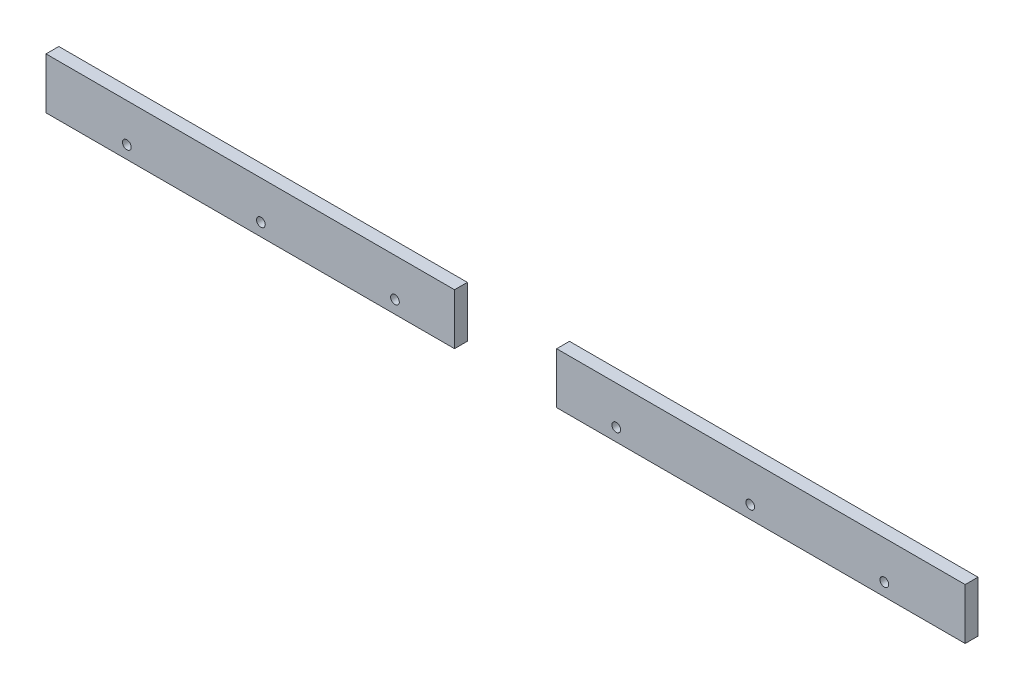
ISO-10303-21;
HEADER;
FILE_DESCRIPTION(('STEP AP214'),'2;1');
FILE_NAME('part.step','',(''),(''),'','','');
FILE_SCHEMA(('AUTOMOTIVE_DESIGN { 1 0 10303 214 1 1 1 1 }'));
ENDSEC;
DATA;
#1=APPLICATION_CONTEXT('core data for automotive mechanical design processes');
#2=APPLICATION_PROTOCOL_DEFINITION('international standard','automotive_design',2000,#1);
#3=PRODUCT_CONTEXT('',#1,'mechanical');
#4=PRODUCT('Part','Part','',(#3));
#5=PRODUCT_RELATED_PRODUCT_CATEGORY('part','',(#4));
#6=PRODUCT_DEFINITION_FORMATION('','',#4);
#7=PRODUCT_DEFINITION_CONTEXT('part definition',#1,'design');
#8=PRODUCT_DEFINITION('design','',#6,#7);
#9=PRODUCT_DEFINITION_SHAPE('','',#8);
#10=(LENGTH_UNIT() NAMED_UNIT(*) SI_UNIT(.MILLI.,.METRE.));
#11=(NAMED_UNIT(*) PLANE_ANGLE_UNIT() SI_UNIT($,.RADIAN.));
#12=(NAMED_UNIT(*) SI_UNIT($,.STERADIAN.) SOLID_ANGLE_UNIT());
#13=UNCERTAINTY_MEASURE_WITH_UNIT(LENGTH_MEASURE(1.E-05),#10,'distance_accuracy_value','');
#14=(GEOMETRIC_REPRESENTATION_CONTEXT(3) GLOBAL_UNCERTAINTY_ASSIGNED_CONTEXT((#13)) GLOBAL_UNIT_ASSIGNED_CONTEXT((#10,
#11,#12)) REPRESENTATION_CONTEXT('',''));
#15=CARTESIAN_POINT('',(0.,0.,0.));
#16=DIRECTION('',(0.,0.,1.));
#17=DIRECTION('',(1.,0.,0.));
#18=AXIS2_PLACEMENT_3D('',#15,#16,#17);
#19=CARTESIAN_POINT('',(-342.9,19.05,9.5631));
#20=DIRECTION('',(0.,-1.,0.));
#21=DIRECTION('',(0.,0.,-1.));
#22=AXIS2_PLACEMENT_3D('',#19,#20,#21);
#23=PLANE('',#22);
#24=DIRECTION('',(-1.,0.,0.));
#25=VECTOR('',#24,1.);
#26=CARTESIAN_POINT('',(-342.9,19.05,9.5631));
#27=LINE('',#26,#25);
#28=CARTESIAN_POINT('',(-38.0999999999997,19.0500000000001,9.5631));
#29=VERTEX_POINT('',#28);
#30=CARTESIAN_POINT('',(-342.9,19.05,9.5631));
#31=VERTEX_POINT('',#30);
#32=EDGE_CURVE('E90',#29,#31,#27,.T.);
#33=ORIENTED_EDGE('',*,*,#32,.F.);
#34=DIRECTION('',(0.,0.,1.));
#35=VECTOR('',#34,1.);
#36=CARTESIAN_POINT('',(-38.0999999999997,19.0500000000001,0.));
#37=LINE('',#36,#35);
#38=CARTESIAN_POINT('',(-38.0999999999997,19.0500000000001,0.));
#39=VERTEX_POINT('',#38);
#40=EDGE_CURVE('E12',#39,#29,#37,.T.);
#41=ORIENTED_EDGE('',*,*,#40,.F.);
#42=DIRECTION('',(-1.,0.,0.));
#43=VECTOR('',#42,1.);
#44=CARTESIAN_POINT('',(-342.9,19.05,0.));
#45=LINE('',#44,#43);
#46=CARTESIAN_POINT('',(-342.9,19.05,0.));
#47=VERTEX_POINT('',#46);
#48=EDGE_CURVE('E48',#39,#47,#45,.T.);
#49=ORIENTED_EDGE('',*,*,#48,.T.);
#50=DIRECTION('',(0.,0.,-1.));
#51=VECTOR('',#50,1.);
#52=CARTESIAN_POINT('',(-342.9,19.05,9.5631));
#53=LINE('',#52,#51);
#54=EDGE_CURVE('E97',#31,#47,#53,.T.);
#55=ORIENTED_EDGE('',*,*,#54,.F.);
#56=EDGE_LOOP('',(#33,#41,#49,#55));
#57=FACE_BOUND('',#56,.T.);
#58=ADVANCED_FACE('F45',(#57),#23,.F.);
#59=CARTESIAN_POINT('',(-342.9,-19.05,9.5631));
#60=DIRECTION('',(0.,1.,0.));
#61=DIRECTION('',(0.,0.,1.));
#62=AXIS2_PLACEMENT_3D('',#59,#60,#61);
#63=PLANE('',#62);
#64=DIRECTION('',(1.,0.,0.));
#65=VECTOR('',#64,1.);
#66=CARTESIAN_POINT('',(-342.9,-19.05,0.));
#67=LINE('',#66,#65);
#68=CARTESIAN_POINT('',(-342.9,-19.05,0.));
#69=VERTEX_POINT('',#68);
#70=CARTESIAN_POINT('',(-38.0999999999997,-19.05,0.));
#71=VERTEX_POINT('',#70);
#72=EDGE_CURVE('E128',#69,#71,#67,.T.);
#73=ORIENTED_EDGE('',*,*,#72,.T.);
#74=DIRECTION('',(0.,0.,1.));
#75=VECTOR('',#74,1.);
#76=CARTESIAN_POINT('',(-38.0999999999997,-19.05,0.));
#77=LINE('',#76,#75);
#78=CARTESIAN_POINT('',(-38.0999999999997,-19.05,9.5631));
#79=VERTEX_POINT('',#78);
#80=EDGE_CURVE('E127',#71,#79,#77,.T.);
#81=ORIENTED_EDGE('',*,*,#80,.T.);
#82=DIRECTION('',(1.,0.,0.));
#83=VECTOR('',#82,1.);
#84=CARTESIAN_POINT('',(-342.9,-19.05,9.5631));
#85=LINE('',#84,#83);
#86=CARTESIAN_POINT('',(-342.9,-19.05,9.5631));
#87=VERTEX_POINT('',#86);
#88=EDGE_CURVE('E95',#87,#79,#85,.T.);
#89=ORIENTED_EDGE('',*,*,#88,.F.);
#90=DIRECTION('',(0.,0.,-1.));
#91=VECTOR('',#90,1.);
#92=CARTESIAN_POINT('',(-342.9,-19.05,9.5631));
#93=LINE('',#92,#91);
#94=EDGE_CURVE('E101',#87,#69,#93,.T.);
#95=ORIENTED_EDGE('',*,*,#94,.T.);
#96=EDGE_LOOP('',(#73,#81,#89,#95));
#97=FACE_BOUND('',#96,.T.);
#98=ADVANCED_FACE('F134',(#97),#63,.F.);
#99=CARTESIAN_POINT('',(0.,0.,9.5631));
#100=DIRECTION('',(0.,0.,-1.));
#101=DIRECTION('',(-1.,0.,0.));
#102=AXIS2_PLACEMENT_3D('',#99,#100,#101);
#103=PLANE('',#102);
#104=CARTESIAN_POINT('',(-82.5499999999997,-9.52500000000001,9.5631));
#105=DIRECTION('',(0.,0.,1.));
#106=DIRECTION('',(1.,0.,0.));
#107=AXIS2_PLACEMENT_3D('',#104,#105,#106);
#108=CIRCLE('',#107,3.25000000000001);
#109=CARTESIAN_POINT('',(-79.2999999999997,-9.52500000000001,9.5631));
#110=VERTEX_POINT('',#109);
#111=EDGE_CURVE('E98',#110,#110,#108,.T.);
#112=ORIENTED_EDGE('',*,*,#111,.F.);
#113=EDGE_LOOP('',(#112));
#114=FACE_BOUND('',#113,.T.);
#115=CARTESIAN_POINT('',(-182.5625,-9.52500000000001,9.5631));
#116=DIRECTION('',(0.,0.,1.));
#117=DIRECTION('',(1.,0.,0.));
#118=AXIS2_PLACEMENT_3D('',#115,#116,#117);
#119=CIRCLE('',#118,3.25000000000001);
#120=CARTESIAN_POINT('',(-179.3125,-9.52500000000001,9.5631));
#121=VERTEX_POINT('',#120);
#122=EDGE_CURVE('E113',#121,#121,#119,.T.);
#123=ORIENTED_EDGE('',*,*,#122,.F.);
#124=EDGE_LOOP('',(#123));
#125=FACE_BOUND('',#124,.T.);
#126=CARTESIAN_POINT('',(-282.575,-9.52500000000001,9.5631));
#127=DIRECTION('',(0.,0.,1.));
#128=DIRECTION('',(1.,0.,0.));
#129=AXIS2_PLACEMENT_3D('',#126,#127,#128);
#130=CIRCLE('',#129,3.24999999999995);
#131=CARTESIAN_POINT('',(-279.325,-9.52500000000001,9.5631));
#132=VERTEX_POINT('',#131);
#133=EDGE_CURVE('E119',#132,#132,#130,.T.);
#134=ORIENTED_EDGE('',*,*,#133,.F.);
#135=EDGE_LOOP('',(#134));
#136=FACE_BOUND('',#135,.T.);
#137=ORIENTED_EDGE('',*,*,#88,.T.);
#138=DIRECTION('',(0.,-1.,0.));
#139=VECTOR('',#138,1.);
#140=CARTESIAN_POINT('',(-38.0999999999997,19.0500000000001,9.5631));
#141=LINE('',#140,#139);
#142=EDGE_CURVE('E54',#29,#79,#141,.T.);
#143=ORIENTED_EDGE('',*,*,#142,.F.);
#144=ORIENTED_EDGE('',*,*,#32,.T.);
#145=DIRECTION('',(0.,-1.,0.));
#146=VECTOR('',#145,1.);
#147=CARTESIAN_POINT('',(-342.9,-19.05,9.5631));
#148=LINE('',#147,#146);
#149=EDGE_CURVE('E94',#31,#87,#148,.T.);
#150=ORIENTED_EDGE('',*,*,#149,.T.);
#151=EDGE_LOOP('',(#137,#143,#144,#150));
#152=FACE_BOUND('',#151,.T.);
#153=ADVANCED_FACE('F92',(#114,#125,#136,#152),#103,.F.);
#154=CARTESIAN_POINT('',(0.,0.,0.));
#155=DIRECTION('',(0.,0.,-1.));
#156=DIRECTION('',(-1.,0.,0.));
#157=AXIS2_PLACEMENT_3D('',#154,#155,#156);
#158=PLANE('',#157);
#159=DIRECTION('',(0.,-1.,0.));
#160=VECTOR('',#159,1.);
#161=CARTESIAN_POINT('',(-38.0999999999997,19.0500000000001,0.));
#162=LINE('',#161,#160);
#163=EDGE_CURVE('E103',#39,#71,#162,.T.);
#164=ORIENTED_EDGE('',*,*,#163,.T.);
#165=ORIENTED_EDGE('',*,*,#72,.F.);
#166=DIRECTION('',(0.,-1.,0.));
#167=VECTOR('',#166,1.);
#168=CARTESIAN_POINT('',(-342.9,-19.05,0.));
#169=LINE('',#168,#167);
#170=EDGE_CURVE('E78',#47,#69,#169,.T.);
#171=ORIENTED_EDGE('',*,*,#170,.F.);
#172=ORIENTED_EDGE('',*,*,#48,.F.);
#173=EDGE_LOOP('',(#164,#165,#171,#172));
#174=FACE_BOUND('',#173,.T.);
#175=CARTESIAN_POINT('',(-82.5499999999997,-9.52500000000001,0.));
#176=DIRECTION('',(0.,0.,1.));
#177=DIRECTION('',(1.,0.,0.));
#178=AXIS2_PLACEMENT_3D('',#175,#176,#177);
#179=CIRCLE('',#178,3.25000000000001);
#180=CARTESIAN_POINT('',(-79.2999999999997,-9.52500000000001,0.));
#181=VERTEX_POINT('',#180);
#182=EDGE_CURVE('E106',#181,#181,#179,.T.);
#183=ORIENTED_EDGE('',*,*,#182,.T.);
#184=EDGE_LOOP('',(#183));
#185=FACE_BOUND('',#184,.T.);
#186=CARTESIAN_POINT('',(-182.5625,-9.52500000000001,0.));
#187=DIRECTION('',(0.,0.,1.));
#188=DIRECTION('',(1.,0.,0.));
#189=AXIS2_PLACEMENT_3D('',#186,#187,#188);
#190=CIRCLE('',#189,3.25000000000001);
#191=CARTESIAN_POINT('',(-179.3125,-9.52500000000001,0.));
#192=VERTEX_POINT('',#191);
#193=EDGE_CURVE('E116',#192,#192,#190,.T.);
#194=ORIENTED_EDGE('',*,*,#193,.T.);
#195=EDGE_LOOP('',(#194));
#196=FACE_BOUND('',#195,.T.);
#197=CARTESIAN_POINT('',(-282.575,-9.52500000000001,0.));
#198=DIRECTION('',(0.,0.,1.));
#199=DIRECTION('',(1.,0.,0.));
#200=AXIS2_PLACEMENT_3D('',#197,#198,#199);
#201=CIRCLE('',#200,3.24999999999995);
#202=CARTESIAN_POINT('',(-279.325,-9.52500000000001,0.));
#203=VERTEX_POINT('',#202);
#204=EDGE_CURVE('E122',#203,#203,#201,.T.);
#205=ORIENTED_EDGE('',*,*,#204,.T.);
#206=EDGE_LOOP('',(#205));
#207=FACE_BOUND('',#206,.T.);
#208=ADVANCED_FACE('F136',(#174,#185,#196,#207),#158,.T.);
#209=CARTESIAN_POINT('',(-342.9,-19.05,9.5631));
#210=DIRECTION('',(1.,0.,0.));
#211=DIRECTION('',(0.,0.,-1.));
#212=AXIS2_PLACEMENT_3D('',#209,#210,#211);
#213=PLANE('',#212);
#214=ORIENTED_EDGE('',*,*,#170,.T.);
#215=ORIENTED_EDGE('',*,*,#94,.F.);
#216=ORIENTED_EDGE('',*,*,#149,.F.);
#217=ORIENTED_EDGE('',*,*,#54,.T.);
#218=EDGE_LOOP('',(#214,#215,#216,#217));
#219=FACE_BOUND('',#218,.T.);
#220=ADVANCED_FACE('F100',(#219),#213,.F.);
#221=CARTESIAN_POINT('',(-82.5499999999997,-9.52500000000001,0.));
#222=DIRECTION('',(0.,0.,1.));
#223=DIRECTION('',(1.,0.,0.));
#224=AXIS2_PLACEMENT_3D('',#221,#222,#223);
#225=CYLINDRICAL_SURFACE('',#224,3.25000000000001);
#226=ORIENTED_EDGE('',*,*,#182,.F.);
#227=EDGE_LOOP('',(#226));
#228=FACE_BOUND('',#227,.T.);
#229=ORIENTED_EDGE('',*,*,#111,.T.);
#230=EDGE_LOOP('',(#229));
#231=FACE_BOUND('',#230,.T.);
#232=ADVANCED_FACE('F162',(#228,#231),#225,.F.);
#233=CARTESIAN_POINT('',(-182.5625,-9.52500000000001,0.));
#234=DIRECTION('',(0.,0.,1.));
#235=DIRECTION('',(1.,0.,0.));
#236=AXIS2_PLACEMENT_3D('',#233,#234,#235);
#237=CYLINDRICAL_SURFACE('',#236,3.25000000000001);
#238=ORIENTED_EDGE('',*,*,#193,.F.);
#239=EDGE_LOOP('',(#238));
#240=FACE_BOUND('',#239,.T.);
#241=ORIENTED_EDGE('',*,*,#122,.T.);
#242=EDGE_LOOP('',(#241));
#243=FACE_BOUND('',#242,.T.);
#244=ADVANCED_FACE('F145',(#240,#243),#237,.F.);
#245=CARTESIAN_POINT('',(-282.575,-9.52500000000001,0.));
#246=DIRECTION('',(0.,0.,1.));
#247=DIRECTION('',(1.,0.,0.));
#248=AXIS2_PLACEMENT_3D('',#245,#246,#247);
#249=CYLINDRICAL_SURFACE('',#248,3.24999999999995);
#250=ORIENTED_EDGE('',*,*,#204,.F.);
#251=EDGE_LOOP('',(#250));
#252=FACE_BOUND('',#251,.T.);
#253=ORIENTED_EDGE('',*,*,#133,.T.);
#254=EDGE_LOOP('',(#253));
#255=FACE_BOUND('',#254,.T.);
#256=ADVANCED_FACE('F140',(#252,#255),#249,.F.);
#257=CARTESIAN_POINT('',(-38.0999999999997,19.0500000000001,0.));
#258=DIRECTION('',(-1.,0.,0.));
#259=DIRECTION('',(0.,0.,1.));
#260=AXIS2_PLACEMENT_3D('',#257,#258,#259);
#261=PLANE('',#260);
#262=ORIENTED_EDGE('',*,*,#142,.T.);
#263=ORIENTED_EDGE('',*,*,#80,.F.);
#264=ORIENTED_EDGE('',*,*,#163,.F.);
#265=ORIENTED_EDGE('',*,*,#40,.T.);
#266=EDGE_LOOP('',(#262,#263,#264,#265));
#267=FACE_BOUND('',#266,.T.);
#268=ADVANCED_FACE('F138',(#267),#261,.F.);
#269=CLOSED_SHELL('',(#58,#98,#153,#208,#220,#232,#244,#256,#268));
#270=MANIFOLD_SOLID_BREP('B2',#269);
#271=CARTESIAN_POINT('',(82.5499999999997,-9.52500000000001,0.));
#272=DIRECTION('',(0.,0.,1.));
#273=DIRECTION('',(1.,0.,0.));
#274=AXIS2_PLACEMENT_3D('',#271,#272,#273);
#275=CYLINDRICAL_SURFACE('',#274,3.25000000000001);
#276=CARTESIAN_POINT('',(82.5499999999997,-9.52500000000001,0.));
#277=DIRECTION('',(0.,0.,-1.));
#278=DIRECTION('',(-1.,0.,0.));
#279=AXIS2_PLACEMENT_3D('',#276,#277,#278);
#280=CIRCLE('',#279,3.25000000000001);
#281=CARTESIAN_POINT('',(79.2999999999997,-9.52500000000001,0.));
#282=VERTEX_POINT('',#281);
#283=EDGE_CURVE('E303',#282,#282,#280,.T.);
#284=ORIENTED_EDGE('',*,*,#283,.T.);
#285=EDGE_LOOP('',(#284));
#286=FACE_BOUND('',#285,.T.);
#287=CARTESIAN_POINT('',(82.5499999999997,-9.52500000000001,9.5631));
#288=DIRECTION('',(0.,0.,-1.));
#289=DIRECTION('',(-1.,0.,0.));
#290=AXIS2_PLACEMENT_3D('',#287,#288,#289);
#291=CIRCLE('',#290,3.25000000000001);
#292=CARTESIAN_POINT('',(79.2999999999997,-9.52500000000001,9.5631));
#293=VERTEX_POINT('',#292);
#294=EDGE_CURVE('E300',#293,#293,#291,.T.);
#295=ORIENTED_EDGE('',*,*,#294,.F.);
#296=EDGE_LOOP('',(#295));
#297=FACE_BOUND('',#296,.T.);
#298=ADVANCED_FACE('F232',(#286,#297),#275,.F.);
#299=CARTESIAN_POINT('',(182.5625,-9.52500000000001,0.));
#300=DIRECTION('',(0.,0.,1.));
#301=DIRECTION('',(1.,0.,0.));
#302=AXIS2_PLACEMENT_3D('',#299,#300,#301);
#303=CYLINDRICAL_SURFACE('',#302,3.25000000000001);
#304=CARTESIAN_POINT('',(182.5625,-9.52500000000001,0.));
#305=DIRECTION('',(0.,0.,-1.));
#306=DIRECTION('',(-1.,0.,0.));
#307=AXIS2_PLACEMENT_3D('',#304,#305,#306);
#308=CIRCLE('',#307,3.25000000000001);
#309=CARTESIAN_POINT('',(179.3125,-9.52500000000001,0.));
#310=VERTEX_POINT('',#309);
#311=EDGE_CURVE('E309',#310,#310,#308,.T.);
#312=ORIENTED_EDGE('',*,*,#311,.T.);
#313=EDGE_LOOP('',(#312));
#314=FACE_BOUND('',#313,.T.);
#315=CARTESIAN_POINT('',(182.5625,-9.52500000000001,9.5631));
#316=DIRECTION('',(0.,0.,-1.));
#317=DIRECTION('',(-1.,0.,0.));
#318=AXIS2_PLACEMENT_3D('',#315,#316,#317);
#319=CIRCLE('',#318,3.25000000000001);
#320=CARTESIAN_POINT('',(179.3125,-9.52500000000001,9.5631));
#321=VERTEX_POINT('',#320);
#322=EDGE_CURVE('E306',#321,#321,#319,.T.);
#323=ORIENTED_EDGE('',*,*,#322,.F.);
#324=EDGE_LOOP('',(#323));
#325=FACE_BOUND('',#324,.T.);
#326=ADVANCED_FACE('F335',(#314,#325),#303,.F.);
#327=CARTESIAN_POINT('',(282.575,-9.52500000000001,0.));
#328=DIRECTION('',(0.,0.,1.));
#329=DIRECTION('',(1.,0.,0.));
#330=AXIS2_PLACEMENT_3D('',#327,#328,#329);
#331=CYLINDRICAL_SURFACE('',#330,3.24999999999995);
#332=CARTESIAN_POINT('',(282.575,-9.52500000000001,0.));
#333=DIRECTION('',(0.,0.,-1.));
#334=DIRECTION('',(-1.,0.,0.));
#335=AXIS2_PLACEMENT_3D('',#332,#333,#334);
#336=CIRCLE('',#335,3.24999999999995);
#337=CARTESIAN_POINT('',(279.325,-9.52500000000001,0.));
#338=VERTEX_POINT('',#337);
#339=EDGE_CURVE('E288',#338,#338,#336,.T.);
#340=ORIENTED_EDGE('',*,*,#339,.T.);
#341=EDGE_LOOP('',(#340));
#342=FACE_BOUND('',#341,.T.);
#343=CARTESIAN_POINT('',(282.575,-9.52500000000001,9.5631));
#344=DIRECTION('',(0.,0.,-1.));
#345=DIRECTION('',(-1.,0.,0.));
#346=AXIS2_PLACEMENT_3D('',#343,#344,#345);
#347=CIRCLE('',#346,3.24999999999995);
#348=CARTESIAN_POINT('',(279.325,-9.52500000000001,9.5631));
#349=VERTEX_POINT('',#348);
#350=EDGE_CURVE('E292',#349,#349,#347,.T.);
#351=ORIENTED_EDGE('',*,*,#350,.F.);
#352=EDGE_LOOP('',(#351));
#353=FACE_BOUND('',#352,.T.);
#354=ADVANCED_FACE('F340',(#342,#353),#331,.F.);
#355=CARTESIAN_POINT('',(342.9,-19.05,9.5631));
#356=DIRECTION('',(-1.,0.,0.));
#357=DIRECTION('',(0.,0.,1.));
#358=AXIS2_PLACEMENT_3D('',#355,#356,#357);
#359=PLANE('',#358);
#360=DIRECTION('',(0.,1.,0.));
#361=VECTOR('',#360,1.);
#362=CARTESIAN_POINT('',(342.9,-19.05,0.));
#363=LINE('',#362,#361);
#364=CARTESIAN_POINT('',(342.9,-19.05,0.));
#365=VERTEX_POINT('',#364);
#366=CARTESIAN_POINT('',(342.9,19.05,0.));
#367=VERTEX_POINT('',#366);
#368=EDGE_CURVE('E284',#365,#367,#363,.T.);
#369=ORIENTED_EDGE('',*,*,#368,.T.);
#370=DIRECTION('',(0.,0.,-1.));
#371=VECTOR('',#370,1.);
#372=CARTESIAN_POINT('',(342.9,19.05,9.5631));
#373=LINE('',#372,#371);
#374=CARTESIAN_POINT('',(342.9,19.05,9.5631));
#375=VERTEX_POINT('',#374);
#376=EDGE_CURVE('E43',#375,#367,#373,.T.);
#377=ORIENTED_EDGE('',*,*,#376,.F.);
#378=DIRECTION('',(0.,1.,0.));
#379=VECTOR('',#378,1.);
#380=CARTESIAN_POINT('',(342.9,-19.05,9.5631));
#381=LINE('',#380,#379);
#382=CARTESIAN_POINT('',(342.9,-19.05,9.5631));
#383=VERTEX_POINT('',#382);
#384=EDGE_CURVE('E278',#383,#375,#381,.T.);
#385=ORIENTED_EDGE('',*,*,#384,.F.);
#386=DIRECTION('',(0.,0.,-1.));
#387=VECTOR('',#386,1.);
#388=CARTESIAN_POINT('',(342.9,-19.05,9.5631));
#389=LINE('',#388,#387);
#390=EDGE_CURVE('E240',#383,#365,#389,.T.);
#391=ORIENTED_EDGE('',*,*,#390,.T.);
#392=EDGE_LOOP('',(#369,#377,#385,#391));
#393=FACE_BOUND('',#392,.T.);
#394=ADVANCED_FACE('F234',(#393),#359,.F.);
#395=CARTESIAN_POINT('',(0.,0.,0.));
#396=DIRECTION('',(0.,0.,-1.));
#397=DIRECTION('',(-1.,0.,0.));
#398=AXIS2_PLACEMENT_3D('',#395,#396,#397);
#399=PLANE('',#398);
#400=DIRECTION('',(0.,1.,0.));
#401=VECTOR('',#400,1.);
#402=CARTESIAN_POINT('',(38.1000000000002,19.05,0.));
#403=LINE('',#402,#401);
#404=CARTESIAN_POINT('',(38.1000000000002,-19.05,0.));
#405=VERTEX_POINT('',#404);
#406=CARTESIAN_POINT('',(38.1000000000002,19.05,0.));
#407=VERTEX_POINT('',#406);
#408=EDGE_CURVE('E315',#405,#407,#403,.T.);
#409=ORIENTED_EDGE('',*,*,#408,.T.);
#410=DIRECTION('',(-1.,0.,0.));
#411=VECTOR('',#410,1.);
#412=CARTESIAN_POINT('',(-342.9,19.05,0.));
#413=LINE('',#412,#411);
#414=EDGE_CURVE('E279',#367,#407,#413,.T.);
#415=ORIENTED_EDGE('',*,*,#414,.F.);
#416=ORIENTED_EDGE('',*,*,#368,.F.);
#417=DIRECTION('',(1.,0.,0.));
#418=VECTOR('',#417,1.);
#419=CARTESIAN_POINT('',(-342.9,-19.05,0.));
#420=LINE('',#419,#418);
#421=EDGE_CURVE('E270',#405,#365,#420,.T.);
#422=ORIENTED_EDGE('',*,*,#421,.F.);
#423=EDGE_LOOP('',(#409,#415,#416,#422));
#424=FACE_BOUND('',#423,.T.);
#425=ORIENTED_EDGE('',*,*,#339,.F.);
#426=EDGE_LOOP('',(#425));
#427=FACE_BOUND('',#426,.T.);
#428=ORIENTED_EDGE('',*,*,#311,.F.);
#429=EDGE_LOOP('',(#428));
#430=FACE_BOUND('',#429,.T.);
#431=ORIENTED_EDGE('',*,*,#283,.F.);
#432=EDGE_LOOP('',(#431));
#433=FACE_BOUND('',#432,.T.);
#434=ADVANCED_FACE('F285',(#424,#427,#430,#433),#399,.T.);
#435=CARTESIAN_POINT('',(0.,0.,9.5631));
#436=DIRECTION('',(0.,0.,-1.));
#437=DIRECTION('',(-1.,0.,0.));
#438=AXIS2_PLACEMENT_3D('',#435,#436,#437);
#439=PLANE('',#438);
#440=ORIENTED_EDGE('',*,*,#350,.T.);
#441=EDGE_LOOP('',(#440));
#442=FACE_BOUND('',#441,.T.);
#443=ORIENTED_EDGE('',*,*,#322,.T.);
#444=EDGE_LOOP('',(#443));
#445=FACE_BOUND('',#444,.T.);
#446=ORIENTED_EDGE('',*,*,#294,.T.);
#447=EDGE_LOOP('',(#446));
#448=FACE_BOUND('',#447,.T.);
#449=DIRECTION('',(-1.,0.,0.));
#450=VECTOR('',#449,1.);
#451=CARTESIAN_POINT('',(-342.9,19.05,9.5631));
#452=LINE('',#451,#450);
#453=CARTESIAN_POINT('',(38.1000000000002,19.05,9.5631));
#454=VERTEX_POINT('',#453);
#455=EDGE_CURVE('E296',#375,#454,#452,.T.);
#456=ORIENTED_EDGE('',*,*,#455,.T.);
#457=DIRECTION('',(0.,1.,0.));
#458=VECTOR('',#457,1.);
#459=CARTESIAN_POINT('',(38.1000000000002,19.05,9.5631));
#460=LINE('',#459,#458);
#461=CARTESIAN_POINT('',(38.1000000000002,-19.05,9.5631));
#462=VERTEX_POINT('',#461);
#463=EDGE_CURVE('E317',#462,#454,#460,.T.);
#464=ORIENTED_EDGE('',*,*,#463,.F.);
#465=DIRECTION('',(1.,0.,0.));
#466=VECTOR('',#465,1.);
#467=CARTESIAN_POINT('',(-342.9,-19.05,9.5631));
#468=LINE('',#467,#466);
#469=EDGE_CURVE('E256',#462,#383,#468,.T.);
#470=ORIENTED_EDGE('',*,*,#469,.T.);
#471=ORIENTED_EDGE('',*,*,#384,.T.);
#472=EDGE_LOOP('',(#456,#464,#470,#471));
#473=FACE_BOUND('',#472,.T.);
#474=ADVANCED_FACE('F322',(#442,#445,#448,#473),#439,.F.);
#475=CARTESIAN_POINT('',(-342.9,-19.05,9.5631));
#476=DIRECTION('',(0.,1.,0.));
#477=DIRECTION('',(0.,0.,1.));
#478=AXIS2_PLACEMENT_3D('',#475,#476,#477);
#479=PLANE('',#478);
#480=ORIENTED_EDGE('',*,*,#469,.F.);
#481=DIRECTION('',(0.,0.,1.));
#482=VECTOR('',#481,1.);
#483=CARTESIAN_POINT('',(38.1000000000002,-19.05,0.));
#484=LINE('',#483,#482);
#485=EDGE_CURVE('E275',#405,#462,#484,.T.);
#486=ORIENTED_EDGE('',*,*,#485,.F.);
#487=ORIENTED_EDGE('',*,*,#421,.T.);
#488=ORIENTED_EDGE('',*,*,#390,.F.);
#489=EDGE_LOOP('',(#480,#486,#487,#488));
#490=FACE_BOUND('',#489,.T.);
#491=ADVANCED_FACE('F272',(#490),#479,.F.);
#492=CARTESIAN_POINT('',(-342.9,19.05,9.5631));
#493=DIRECTION('',(0.,-1.,0.));
#494=DIRECTION('',(0.,0.,-1.));
#495=AXIS2_PLACEMENT_3D('',#492,#493,#494);
#496=PLANE('',#495);
#497=ORIENTED_EDGE('',*,*,#414,.T.);
#498=DIRECTION('',(0.,0.,1.));
#499=VECTOR('',#498,1.);
#500=CARTESIAN_POINT('',(38.1000000000002,19.05,0.));
#501=LINE('',#500,#499);
#502=EDGE_CURVE('E247',#407,#454,#501,.T.);
#503=ORIENTED_EDGE('',*,*,#502,.T.);
#504=ORIENTED_EDGE('',*,*,#455,.F.);
#505=ORIENTED_EDGE('',*,*,#376,.T.);
#506=EDGE_LOOP('',(#497,#503,#504,#505));
#507=FACE_BOUND('',#506,.T.);
#508=ADVANCED_FACE('F320',(#507),#496,.F.);
#509=CARTESIAN_POINT('',(38.1000000000002,19.05,0.));
#510=DIRECTION('',(1.,0.,0.));
#511=DIRECTION('',(0.,0.,-1.));
#512=AXIS2_PLACEMENT_3D('',#509,#510,#511);
#513=PLANE('',#512);
#514=ORIENTED_EDGE('',*,*,#463,.T.);
#515=ORIENTED_EDGE('',*,*,#502,.F.);
#516=ORIENTED_EDGE('',*,*,#408,.F.);
#517=ORIENTED_EDGE('',*,*,#485,.T.);
#518=EDGE_LOOP('',(#514,#515,#516,#517));
#519=FACE_BOUND('',#518,.T.);
#520=ADVANCED_FACE('F348',(#519),#513,.F.);
#521=CLOSED_SHELL('',(#298,#326,#354,#394,#434,#474,#491,#508,#520));
#522=MANIFOLD_SOLID_BREP('B6',#521);
#523=ADVANCED_BREP_SHAPE_REPRESENTATION('',(#18,#270,#522),#14);
#524=SHAPE_DEFINITION_REPRESENTATION(#9,#523);
ENDSEC;
END-ISO-10303-21;
